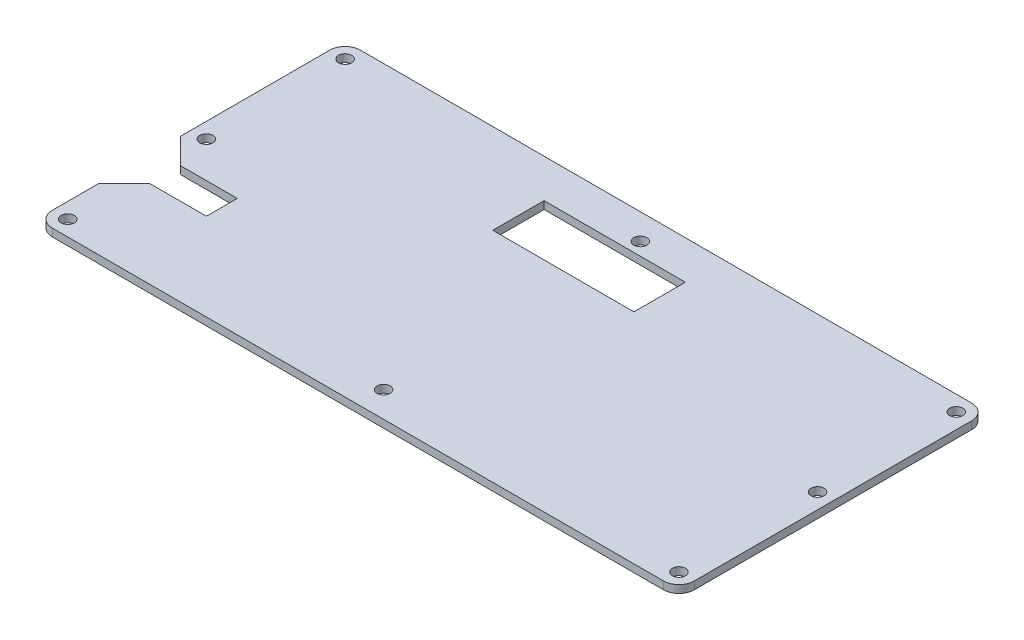
ISO-10303-21;
HEADER;
FILE_DESCRIPTION(('STEP AP214'),'2;1');
FILE_NAME('part.step','',(''),(''),'','','');
FILE_SCHEMA(('AUTOMOTIVE_DESIGN { 1 0 10303 214 1 1 1 1 }'));
ENDSEC;
DATA;
#1=APPLICATION_CONTEXT('core data for automotive mechanical design processes');
#2=APPLICATION_PROTOCOL_DEFINITION('international standard','automotive_design',2000,#1);
#3=PRODUCT_CONTEXT('',#1,'mechanical');
#4=PRODUCT('Part','Part','',(#3));
#5=PRODUCT_RELATED_PRODUCT_CATEGORY('part','',(#4));
#6=PRODUCT_DEFINITION_FORMATION('','',#4);
#7=PRODUCT_DEFINITION_CONTEXT('part definition',#1,'design');
#8=PRODUCT_DEFINITION('design','',#6,#7);
#9=PRODUCT_DEFINITION_SHAPE('','',#8);
#10=(LENGTH_UNIT() NAMED_UNIT(*) SI_UNIT(.MILLI.,.METRE.));
#11=(NAMED_UNIT(*) PLANE_ANGLE_UNIT() SI_UNIT($,.RADIAN.));
#12=(NAMED_UNIT(*) SI_UNIT($,.STERADIAN.) SOLID_ANGLE_UNIT());
#13=UNCERTAINTY_MEASURE_WITH_UNIT(LENGTH_MEASURE(1.E-05),#10,'distance_accuracy_value','');
#14=(GEOMETRIC_REPRESENTATION_CONTEXT(3) GLOBAL_UNCERTAINTY_ASSIGNED_CONTEXT((#13)) GLOBAL_UNIT_ASSIGNED_CONTEXT((#10,
#11,#12)) REPRESENTATION_CONTEXT('',''));
#15=CARTESIAN_POINT('',(0.,0.,0.));
#16=DIRECTION('',(0.,0.,1.));
#17=DIRECTION('',(1.,0.,0.));
#18=AXIS2_PLACEMENT_3D('',#15,#16,#17);
#19=CARTESIAN_POINT('',(22.2077113104315,3.,-126.233643966349));
#20=DIRECTION('',(0.,1.,0.));
#21=DIRECTION('',(0.,0.,1.));
#22=AXIS2_PLACEMENT_3D('',#19,#20,#21);
#23=PLANE('',#22);
#24=CARTESIAN_POINT('',(260.207711310431,3.,-72.2336439663486));
#25=DIRECTION('',(0.,1.,0.));
#26=DIRECTION('',(0.,0.,1.));
#27=AXIS2_PLACEMENT_3D('',#24,#25,#26);
#28=CIRCLE('',#27,2.55);
#29=CARTESIAN_POINT('',(260.207711310431,3.,-69.6836439663486));
#30=VERTEX_POINT('',#29);
#31=EDGE_CURVE('E201',#30,#30,#28,.T.);
#32=ORIENTED_EDGE('',*,*,#31,.F.);
#33=EDGE_LOOP('',(#32));
#34=FACE_BOUND('',#33,.T.);
#35=CARTESIAN_POINT('',(260.207711310431,3.,-18.2336439663486));
#36=DIRECTION('',(0.,1.,0.));
#37=DIRECTION('',(0.,0.,1.));
#38=AXIS2_PLACEMENT_3D('',#35,#36,#37);
#39=CIRCLE('',#38,2.54999999999955);
#40=CARTESIAN_POINT('',(260.207711310431,3.,-15.6836439663491));
#41=VERTEX_POINT('',#40);
#42=EDGE_CURVE('E213',#41,#41,#39,.T.);
#43=ORIENTED_EDGE('',*,*,#42,.F.);
#44=EDGE_LOOP('',(#43));
#45=FACE_BOUND('',#44,.T.);
#46=CARTESIAN_POINT('',(141.207711310431,3.,-122.233643966349));
#47=DIRECTION('',(0.,1.,0.));
#48=DIRECTION('',(0.,0.,1.));
#49=AXIS2_PLACEMENT_3D('',#46,#47,#48);
#50=CIRCLE('',#49,2.55);
#51=CARTESIAN_POINT('',(141.207711310431,3.,-119.683643966349));
#52=VERTEX_POINT('',#51);
#53=EDGE_CURVE('E225',#52,#52,#50,.T.);
#54=ORIENTED_EDGE('',*,*,#53,.F.);
#55=EDGE_LOOP('',(#54));
#56=FACE_BOUND('',#55,.T.);
#57=CARTESIAN_POINT('',(22.2077113104315,3.,-126.233643966349));
#58=DIRECTION('',(0.,1.,0.));
#59=DIRECTION('',(0.,0.,1.));
#60=AXIS2_PLACEMENT_3D('',#57,#58,#59);
#61=CIRCLE('',#60,2.55000000000045);
#62=CARTESIAN_POINT('',(22.2077113104315,3.,-123.683643966348));
#63=VERTEX_POINT('',#62);
#64=EDGE_CURVE('E237',#63,#63,#61,.T.);
#65=ORIENTED_EDGE('',*,*,#64,.F.);
#66=EDGE_LOOP('',(#65));
#67=FACE_BOUND('',#66,.T.);
#68=DIRECTION('',(0.70710678118654,0.,0.707106781186556));
#69=VECTOR('',#68,1.);
#70=CARTESIAN_POINT('',(26.2077113104315,3.,-58.2336439663486));
#71=LINE('',#70,#69);
#72=CARTESIAN_POINT('',(16.2077113104315,3.,-68.2336439663488));
#73=VERTEX_POINT('',#72);
#74=CARTESIAN_POINT('',(26.2077113104315,3.,-58.2336439663486));
#75=VERTEX_POINT('',#74);
#76=EDGE_CURVE('E243',#73,#75,#71,.T.);
#77=ORIENTED_EDGE('',*,*,#76,.T.);
#78=DIRECTION('',(1.,0.,0.));
#79=VECTOR('',#78,1.);
#80=CARTESIAN_POINT('',(26.2077113104315,3.,-58.2336439663486));
#81=LINE('',#80,#79);
#82=CARTESIAN_POINT('',(48.2077113104315,3.,-58.2336439663486));
#83=VERTEX_POINT('',#82);
#84=EDGE_CURVE('E246',#75,#83,#81,.T.);
#85=ORIENTED_EDGE('',*,*,#84,.T.);
#86=DIRECTION('',(0.,0.,1.));
#87=VECTOR('',#86,1.);
#88=CARTESIAN_POINT('',(48.2077113104315,3.,-58.2336439663486));
#89=LINE('',#88,#87);
#90=CARTESIAN_POINT('',(48.2077113104315,3.,-46.2336439663486));
#91=VERTEX_POINT('',#90);
#92=EDGE_CURVE('E249',#83,#91,#89,.T.);
#93=ORIENTED_EDGE('',*,*,#92,.T.);
#94=DIRECTION('',(-1.,0.,0.));
#95=VECTOR('',#94,1.);
#96=CARTESIAN_POINT('',(48.2077113104315,3.,-46.2336439663486));
#97=LINE('',#96,#95);
#98=CARTESIAN_POINT('',(26.2077113104315,3.,-46.2336439663486));
#99=VERTEX_POINT('',#98);
#100=EDGE_CURVE('E251',#91,#99,#97,.T.);
#101=ORIENTED_EDGE('',*,*,#100,.T.);
#102=DIRECTION('',(-0.707106781186539,0.,0.707106781186556));
#103=VECTOR('',#102,1.);
#104=CARTESIAN_POINT('',(26.2077113104315,3.,-46.2336439663486));
#105=LINE('',#104,#103);
#106=CARTESIAN_POINT('',(16.2077113104315,3.,-36.2336439663484));
#107=VERTEX_POINT('',#106);
#108=EDGE_CURVE('E253',#99,#107,#105,.T.);
#109=ORIENTED_EDGE('',*,*,#108,.T.);
#110=DIRECTION('',(0.,0.,1.));
#111=VECTOR('',#110,1.);
#112=CARTESIAN_POINT('',(16.2077113104315,3.,-18.2336439663486));
#113=LINE('',#112,#111);
#114=CARTESIAN_POINT('',(16.2077113104315,3.,-18.2336439663486));
#115=VERTEX_POINT('',#114);
#116=EDGE_CURVE('E255',#107,#115,#113,.T.);
#117=ORIENTED_EDGE('',*,*,#116,.T.);
#118=CARTESIAN_POINT('',(22.2077113104315,3.,-18.2336439663486));
#119=DIRECTION('',(0.,1.,0.));
#120=DIRECTION('',(0.,0.,1.));
#121=AXIS2_PLACEMENT_3D('',#118,#119,#120);
#122=CIRCLE('',#121,6.);
#123=CARTESIAN_POINT('',(22.2077113104315,3.,-12.2336439663486));
#124=VERTEX_POINT('',#123);
#125=EDGE_CURVE('E257',#115,#124,#122,.T.);
#126=ORIENTED_EDGE('',*,*,#125,.T.);
#127=DIRECTION('',(1.,0.,0.));
#128=VECTOR('',#127,1.);
#129=CARTESIAN_POINT('',(260.207711310431,3.,-12.2336439663486));
#130=LINE('',#129,#128);
#131=CARTESIAN_POINT('',(260.207711310431,3.,-12.2336439663486));
#132=VERTEX_POINT('',#131);
#133=EDGE_CURVE('E259',#124,#132,#130,.T.);
#134=ORIENTED_EDGE('',*,*,#133,.T.);
#135=CARTESIAN_POINT('',(260.207711310431,3.,-18.2336439663486));
#136=DIRECTION('',(0.,1.,0.));
#137=DIRECTION('',(0.,0.,1.));
#138=AXIS2_PLACEMENT_3D('',#135,#136,#137);
#139=CIRCLE('',#138,6.);
#140=CARTESIAN_POINT('',(266.207711310431,3.,-18.2336439663486));
#141=VERTEX_POINT('',#140);
#142=EDGE_CURVE('E261',#132,#141,#139,.T.);
#143=ORIENTED_EDGE('',*,*,#142,.T.);
#144=DIRECTION('',(0.,0.,-1.));
#145=VECTOR('',#144,1.);
#146=CARTESIAN_POINT('',(266.207711310431,3.,-126.233643966349));
#147=LINE('',#146,#145);
#148=CARTESIAN_POINT('',(266.207711310431,3.,-126.233643966349));
#149=VERTEX_POINT('',#148);
#150=EDGE_CURVE('E263',#141,#149,#147,.T.);
#151=ORIENTED_EDGE('',*,*,#150,.T.);
#152=CARTESIAN_POINT('',(260.207711310431,3.,-126.233643966349));
#153=DIRECTION('',(0.,1.,0.));
#154=DIRECTION('',(0.,0.,1.));
#155=AXIS2_PLACEMENT_3D('',#152,#153,#154);
#156=CIRCLE('',#155,6.00000000000001);
#157=CARTESIAN_POINT('',(260.207711310431,3.,-132.233643966349));
#158=VERTEX_POINT('',#157);
#159=EDGE_CURVE('E265',#149,#158,#156,.T.);
#160=ORIENTED_EDGE('',*,*,#159,.T.);
#161=DIRECTION('',(-1.,0.,0.));
#162=VECTOR('',#161,1.);
#163=CARTESIAN_POINT('',(22.2077113104315,3.,-132.233643966349));
#164=LINE('',#163,#162);
#165=CARTESIAN_POINT('',(22.2077113104315,3.,-132.233643966349));
#166=VERTEX_POINT('',#165);
#167=EDGE_CURVE('E267',#158,#166,#164,.T.);
#168=ORIENTED_EDGE('',*,*,#167,.T.);
#169=CARTESIAN_POINT('',(22.2077113104315,3.,-126.233643966349));
#170=DIRECTION('',(0.,1.,0.));
#171=DIRECTION('',(0.,0.,1.));
#172=AXIS2_PLACEMENT_3D('',#169,#170,#171);
#173=CIRCLE('',#172,6.);
#174=CARTESIAN_POINT('',(16.2077113104315,3.,-126.233643966349));
#175=VERTEX_POINT('',#174);
#176=EDGE_CURVE('E269',#166,#175,#173,.T.);
#177=ORIENTED_EDGE('',*,*,#176,.T.);
#178=DIRECTION('',(0.,0.,1.));
#179=VECTOR('',#178,1.);
#180=CARTESIAN_POINT('',(16.2077113104315,3.,-68.2336439663488));
#181=LINE('',#180,#179);
#182=EDGE_CURVE('E271',#175,#73,#181,.T.);
#183=ORIENTED_EDGE('',*,*,#182,.T.);
#184=EDGE_LOOP('',(#77,#85,#93,#101,#109,#117,#126,#134,#143,#151,#160,#168,#177,#183));
#185=FACE_BOUND('',#184,.T.);
#186=CARTESIAN_POINT('',(260.207711310431,3.,-126.233643966349));
#187=DIRECTION('',(0.,1.,0.));
#188=DIRECTION('',(0.,0.,1.));
#189=AXIS2_PLACEMENT_3D('',#186,#187,#188);
#190=CIRCLE('',#189,2.54999999999955);
#191=CARTESIAN_POINT('',(260.207711310431,3.,-123.683643966349));
#192=VERTEX_POINT('',#191);
#193=EDGE_CURVE('E231',#192,#192,#190,.T.);
#194=ORIENTED_EDGE('',*,*,#193,.F.);
#195=EDGE_LOOP('',(#194));
#196=FACE_BOUND('',#195,.T.);
#197=CARTESIAN_POINT('',(22.2077113104315,3.,-18.2336439663486));
#198=DIRECTION('',(0.,1.,0.));
#199=DIRECTION('',(0.,0.,1.));
#200=AXIS2_PLACEMENT_3D('',#197,#198,#199);
#201=CIRCLE('',#200,2.55000000000045);
#202=CARTESIAN_POINT('',(22.2077113104315,3.,-15.6836439663482));
#203=VERTEX_POINT('',#202);
#204=EDGE_CURVE('E219',#203,#203,#201,.T.);
#205=ORIENTED_EDGE('',*,*,#204,.F.);
#206=EDGE_LOOP('',(#205));
#207=FACE_BOUND('',#206,.T.);
#208=CARTESIAN_POINT('',(141.207711310431,3.,-22.2336439663486));
#209=DIRECTION('',(0.,1.,0.));
#210=DIRECTION('',(0.,0.,1.));
#211=AXIS2_PLACEMENT_3D('',#208,#209,#210);
#212=CIRCLE('',#211,2.55);
#213=CARTESIAN_POINT('',(141.207711310431,3.,-19.6836439663486));
#214=VERTEX_POINT('',#213);
#215=EDGE_CURVE('E207',#214,#214,#212,.T.);
#216=ORIENTED_EDGE('',*,*,#215,.F.);
#217=EDGE_LOOP('',(#216));
#218=FACE_BOUND('',#217,.T.);
#219=CARTESIAN_POINT('',(22.2077113104319,3.,-72.2336439663486));
#220=DIRECTION('',(0.,1.,0.));
#221=DIRECTION('',(0.,0.,1.));
#222=AXIS2_PLACEMENT_3D('',#219,#220,#221);
#223=CIRCLE('',#222,2.55);
#224=CARTESIAN_POINT('',(22.2077113104319,3.,-69.6836439663486));
#225=VERTEX_POINT('',#224);
#226=EDGE_CURVE('E195',#225,#225,#223,.T.);
#227=ORIENTED_EDGE('',*,*,#226,.F.);
#228=EDGE_LOOP('',(#227));
#229=FACE_BOUND('',#228,.T.);
#230=DIRECTION('',(0.,0.,-1.));
#231=VECTOR('',#230,1.);
#232=CARTESIAN_POINT('',(163.707711310431,3.,-117.233643966349));
#233=LINE('',#232,#231);
#234=CARTESIAN_POINT('',(163.707711310431,3.,-97.2336439663486));
#235=VERTEX_POINT('',#234);
#236=CARTESIAN_POINT('',(163.707711310431,3.,-117.233643966349));
#237=VERTEX_POINT('',#236);
#238=EDGE_CURVE('E167',#235,#237,#233,.T.);
#239=ORIENTED_EDGE('',*,*,#238,.F.);
#240=DIRECTION('',(1.,0.,0.));
#241=VECTOR('',#240,1.);
#242=CARTESIAN_POINT('',(163.707711310431,3.,-97.2336439663486));
#243=LINE('',#242,#241);
#244=CARTESIAN_POINT('',(108.707711310431,3.,-97.2336439663486));
#245=VERTEX_POINT('',#244);
#246=EDGE_CURVE('E159',#245,#235,#243,.T.);
#247=ORIENTED_EDGE('',*,*,#246,.F.);
#248=DIRECTION('',(0.,0.,1.));
#249=VECTOR('',#248,1.);
#250=CARTESIAN_POINT('',(108.707711310431,3.,-97.2336439663486));
#251=LINE('',#250,#249);
#252=CARTESIAN_POINT('',(108.707711310431,3.,-117.233643966349));
#253=VERTEX_POINT('',#252);
#254=EDGE_CURVE('E181',#253,#245,#251,.T.);
#255=ORIENTED_EDGE('',*,*,#254,.F.);
#256=DIRECTION('',(-1.,0.,0.));
#257=VECTOR('',#256,1.);
#258=CARTESIAN_POINT('',(108.707711310431,3.,-117.233643966349));
#259=LINE('',#258,#257);
#260=EDGE_CURVE('E179',#237,#253,#259,.T.);
#261=ORIENTED_EDGE('',*,*,#260,.F.);
#262=EDGE_LOOP('',(#239,#247,#255,#261));
#263=FACE_BOUND('',#262,.T.);
#264=ADVANCED_FACE('F34',(#34,#45,#56,#67,#185,#196,#207,#218,#229,#263),#23,.T.);
#265=CARTESIAN_POINT('',(22.2077113104315,0.,-126.233643966349));
#266=DIRECTION('',(0.,1.,0.));
#267=DIRECTION('',(0.,0.,1.));
#268=AXIS2_PLACEMENT_3D('',#265,#266,#267);
#269=PLANE('',#268);
#270=CARTESIAN_POINT('',(22.2077113104319,0.,-72.2336439663486));
#271=DIRECTION('',(0.,1.,0.));
#272=DIRECTION('',(0.,0.,1.));
#273=AXIS2_PLACEMENT_3D('',#270,#271,#272);
#274=CIRCLE('',#273,2.55);
#275=CARTESIAN_POINT('',(22.2077113104319,0.,-69.6836439663486));
#276=VERTEX_POINT('',#275);
#277=EDGE_CURVE('E175',#276,#276,#274,.T.);
#278=ORIENTED_EDGE('',*,*,#277,.T.);
#279=EDGE_LOOP('',(#278));
#280=FACE_BOUND('',#279,.T.);
#281=CARTESIAN_POINT('',(260.207711310431,0.,-72.2336439663486));
#282=DIRECTION('',(0.,1.,0.));
#283=DIRECTION('',(0.,0.,1.));
#284=AXIS2_PLACEMENT_3D('',#281,#282,#283);
#285=CIRCLE('',#284,2.55);
#286=CARTESIAN_POINT('',(260.207711310431,0.,-69.6836439663486));
#287=VERTEX_POINT('',#286);
#288=EDGE_CURVE('E198',#287,#287,#285,.T.);
#289=ORIENTED_EDGE('',*,*,#288,.T.);
#290=EDGE_LOOP('',(#289));
#291=FACE_BOUND('',#290,.T.);
#292=CARTESIAN_POINT('',(141.207711310431,0.,-22.2336439663486));
#293=DIRECTION('',(0.,1.,0.));
#294=DIRECTION('',(0.,0.,1.));
#295=AXIS2_PLACEMENT_3D('',#292,#293,#294);
#296=CIRCLE('',#295,2.55);
#297=CARTESIAN_POINT('',(141.207711310431,0.,-19.6836439663486));
#298=VERTEX_POINT('',#297);
#299=EDGE_CURVE('E204',#298,#298,#296,.T.);
#300=ORIENTED_EDGE('',*,*,#299,.T.);
#301=EDGE_LOOP('',(#300));
#302=FACE_BOUND('',#301,.T.);
#303=CARTESIAN_POINT('',(260.207711310431,0.,-18.2336439663486));
#304=DIRECTION('',(0.,1.,0.));
#305=DIRECTION('',(0.,0.,1.));
#306=AXIS2_PLACEMENT_3D('',#303,#304,#305);
#307=CIRCLE('',#306,2.54999999999955);
#308=CARTESIAN_POINT('',(260.207711310431,0.,-15.6836439663491));
#309=VERTEX_POINT('',#308);
#310=EDGE_CURVE('E210',#309,#309,#307,.T.);
#311=ORIENTED_EDGE('',*,*,#310,.T.);
#312=EDGE_LOOP('',(#311));
#313=FACE_BOUND('',#312,.T.);
#314=CARTESIAN_POINT('',(22.2077113104315,0.,-18.2336439663486));
#315=DIRECTION('',(0.,1.,0.));
#316=DIRECTION('',(0.,0.,1.));
#317=AXIS2_PLACEMENT_3D('',#314,#315,#316);
#318=CIRCLE('',#317,2.55000000000045);
#319=CARTESIAN_POINT('',(22.2077113104315,0.,-15.6836439663482));
#320=VERTEX_POINT('',#319);
#321=EDGE_CURVE('E216',#320,#320,#318,.T.);
#322=ORIENTED_EDGE('',*,*,#321,.T.);
#323=EDGE_LOOP('',(#322));
#324=FACE_BOUND('',#323,.T.);
#325=CARTESIAN_POINT('',(141.207711310431,0.,-122.233643966349));
#326=DIRECTION('',(0.,1.,0.));
#327=DIRECTION('',(0.,0.,1.));
#328=AXIS2_PLACEMENT_3D('',#325,#326,#327);
#329=CIRCLE('',#328,2.55);
#330=CARTESIAN_POINT('',(141.207711310431,0.,-119.683643966349));
#331=VERTEX_POINT('',#330);
#332=EDGE_CURVE('E222',#331,#331,#329,.T.);
#333=ORIENTED_EDGE('',*,*,#332,.T.);
#334=EDGE_LOOP('',(#333));
#335=FACE_BOUND('',#334,.T.);
#336=CARTESIAN_POINT('',(260.207711310431,0.,-126.233643966349));
#337=DIRECTION('',(0.,1.,0.));
#338=DIRECTION('',(0.,0.,1.));
#339=AXIS2_PLACEMENT_3D('',#336,#337,#338);
#340=CIRCLE('',#339,2.54999999999955);
#341=CARTESIAN_POINT('',(260.207711310431,0.,-123.683643966349));
#342=VERTEX_POINT('',#341);
#343=EDGE_CURVE('E228',#342,#342,#340,.T.);
#344=ORIENTED_EDGE('',*,*,#343,.T.);
#345=EDGE_LOOP('',(#344));
#346=FACE_BOUND('',#345,.T.);
#347=CARTESIAN_POINT('',(22.2077113104315,0.,-126.233643966349));
#348=DIRECTION('',(0.,1.,0.));
#349=DIRECTION('',(0.,0.,1.));
#350=AXIS2_PLACEMENT_3D('',#347,#348,#349);
#351=CIRCLE('',#350,2.55000000000045);
#352=CARTESIAN_POINT('',(22.2077113104315,0.,-123.683643966348));
#353=VERTEX_POINT('',#352);
#354=EDGE_CURVE('E234',#353,#353,#351,.T.);
#355=ORIENTED_EDGE('',*,*,#354,.T.);
#356=EDGE_LOOP('',(#355));
#357=FACE_BOUND('',#356,.T.);
#358=DIRECTION('',(0.70710678118654,0.,0.707106781186556));
#359=VECTOR('',#358,1.);
#360=CARTESIAN_POINT('',(26.2077113104315,0.,-58.2336439663486));
#361=LINE('',#360,#359);
#362=CARTESIAN_POINT('',(16.2077113104315,0.,-68.2336439663488));
#363=VERTEX_POINT('',#362);
#364=CARTESIAN_POINT('',(26.2077113104315,0.,-58.2336439663486));
#365=VERTEX_POINT('',#364);
#366=EDGE_CURVE('E240',#363,#365,#361,.T.);
#367=ORIENTED_EDGE('',*,*,#366,.F.);
#368=DIRECTION('',(0.,0.,1.));
#369=VECTOR('',#368,1.);
#370=CARTESIAN_POINT('',(16.2077113104315,0.,-68.2336439663488));
#371=LINE('',#370,#369);
#372=CARTESIAN_POINT('',(16.2077113104315,0.,-126.233643966349));
#373=VERTEX_POINT('',#372);
#374=EDGE_CURVE('E247',#373,#363,#371,.T.);
#375=ORIENTED_EDGE('',*,*,#374,.F.);
#376=CARTESIAN_POINT('',(22.2077113104315,0.,-126.233643966349));
#377=DIRECTION('',(0.,1.,0.));
#378=DIRECTION('',(0.,0.,1.));
#379=AXIS2_PLACEMENT_3D('',#376,#377,#378);
#380=CIRCLE('',#379,6.);
#381=CARTESIAN_POINT('',(22.2077113104315,0.,-132.233643966349));
#382=VERTEX_POINT('',#381);
#383=EDGE_CURVE('E298',#382,#373,#380,.T.);
#384=ORIENTED_EDGE('',*,*,#383,.F.);
#385=DIRECTION('',(-1.,0.,0.));
#386=VECTOR('',#385,1.);
#387=CARTESIAN_POINT('',(22.2077113104315,0.,-132.233643966349));
#388=LINE('',#387,#386);
#389=CARTESIAN_POINT('',(260.207711310431,0.,-132.233643966349));
#390=VERTEX_POINT('',#389);
#391=EDGE_CURVE('E296',#390,#382,#388,.T.);
#392=ORIENTED_EDGE('',*,*,#391,.F.);
#393=CARTESIAN_POINT('',(260.207711310431,0.,-126.233643966349));
#394=DIRECTION('',(0.,1.,0.));
#395=DIRECTION('',(0.,0.,1.));
#396=AXIS2_PLACEMENT_3D('',#393,#394,#395);
#397=CIRCLE('',#396,6.00000000000001);
#398=CARTESIAN_POINT('',(266.207711310431,0.,-126.233643966349));
#399=VERTEX_POINT('',#398);
#400=EDGE_CURVE('E294',#399,#390,#397,.T.);
#401=ORIENTED_EDGE('',*,*,#400,.F.);
#402=DIRECTION('',(0.,0.,-1.));
#403=VECTOR('',#402,1.);
#404=CARTESIAN_POINT('',(266.207711310431,0.,-126.233643966349));
#405=LINE('',#404,#403);
#406=CARTESIAN_POINT('',(266.207711310431,0.,-18.2336439663486));
#407=VERTEX_POINT('',#406);
#408=EDGE_CURVE('E292',#407,#399,#405,.T.);
#409=ORIENTED_EDGE('',*,*,#408,.F.);
#410=CARTESIAN_POINT('',(260.207711310431,0.,-18.2336439663486));
#411=DIRECTION('',(0.,1.,0.));
#412=DIRECTION('',(0.,0.,1.));
#413=AXIS2_PLACEMENT_3D('',#410,#411,#412);
#414=CIRCLE('',#413,6.);
#415=CARTESIAN_POINT('',(260.207711310431,0.,-12.2336439663486));
#416=VERTEX_POINT('',#415);
#417=EDGE_CURVE('E290',#416,#407,#414,.T.);
#418=ORIENTED_EDGE('',*,*,#417,.F.);
#419=DIRECTION('',(1.,0.,0.));
#420=VECTOR('',#419,1.);
#421=CARTESIAN_POINT('',(260.207711310431,0.,-12.2336439663486));
#422=LINE('',#421,#420);
#423=CARTESIAN_POINT('',(22.2077113104315,0.,-12.2336439663486));
#424=VERTEX_POINT('',#423);
#425=EDGE_CURVE('E288',#424,#416,#422,.T.);
#426=ORIENTED_EDGE('',*,*,#425,.F.);
#427=CARTESIAN_POINT('',(22.2077113104315,0.,-18.2336439663486));
#428=DIRECTION('',(0.,1.,0.));
#429=DIRECTION('',(0.,0.,1.));
#430=AXIS2_PLACEMENT_3D('',#427,#428,#429);
#431=CIRCLE('',#430,6.);
#432=CARTESIAN_POINT('',(16.2077113104315,0.,-18.2336439663486));
#433=VERTEX_POINT('',#432);
#434=EDGE_CURVE('E286',#433,#424,#431,.T.);
#435=ORIENTED_EDGE('',*,*,#434,.F.);
#436=DIRECTION('',(0.,0.,1.));
#437=VECTOR('',#436,1.);
#438=CARTESIAN_POINT('',(16.2077113104315,0.,-18.2336439663486));
#439=LINE('',#438,#437);
#440=CARTESIAN_POINT('',(16.2077113104315,0.,-36.2336439663484));
#441=VERTEX_POINT('',#440);
#442=EDGE_CURVE('E284',#441,#433,#439,.T.);
#443=ORIENTED_EDGE('',*,*,#442,.F.);
#444=DIRECTION('',(-0.707106781186539,0.,0.707106781186556));
#445=VECTOR('',#444,1.);
#446=CARTESIAN_POINT('',(26.2077113104315,0.,-46.2336439663486));
#447=LINE('',#446,#445);
#448=CARTESIAN_POINT('',(26.2077113104315,0.,-46.2336439663486));
#449=VERTEX_POINT('',#448);
#450=EDGE_CURVE('E282',#449,#441,#447,.T.);
#451=ORIENTED_EDGE('',*,*,#450,.F.);
#452=DIRECTION('',(-1.,0.,0.));
#453=VECTOR('',#452,1.);
#454=CARTESIAN_POINT('',(48.2077113104315,0.,-46.2336439663486));
#455=LINE('',#454,#453);
#456=CARTESIAN_POINT('',(48.2077113104315,0.,-46.2336439663486));
#457=VERTEX_POINT('',#456);
#458=EDGE_CURVE('E280',#457,#449,#455,.T.);
#459=ORIENTED_EDGE('',*,*,#458,.F.);
#460=DIRECTION('',(0.,0.,1.));
#461=VECTOR('',#460,1.);
#462=CARTESIAN_POINT('',(48.2077113104315,0.,-58.2336439663486));
#463=LINE('',#462,#461);
#464=CARTESIAN_POINT('',(48.2077113104315,0.,-58.2336439663486));
#465=VERTEX_POINT('',#464);
#466=EDGE_CURVE('E278',#465,#457,#463,.T.);
#467=ORIENTED_EDGE('',*,*,#466,.F.);
#468=DIRECTION('',(1.,0.,0.));
#469=VECTOR('',#468,1.);
#470=CARTESIAN_POINT('',(26.2077113104315,0.,-58.2336439663486));
#471=LINE('',#470,#469);
#472=EDGE_CURVE('E276',#365,#465,#471,.T.);
#473=ORIENTED_EDGE('',*,*,#472,.F.);
#474=EDGE_LOOP('',(#367,#375,#384,#392,#401,#409,#418,#426,#435,#443,#451,#459,#467,#473));
#475=FACE_BOUND('',#474,.T.);
#476=DIRECTION('',(1.,0.,0.));
#477=VECTOR('',#476,1.);
#478=CARTESIAN_POINT('',(163.707711310431,0.,-97.2336439663486));
#479=LINE('',#478,#477);
#480=CARTESIAN_POINT('',(108.707711310431,0.,-97.2336439663486));
#481=VERTEX_POINT('',#480);
#482=CARTESIAN_POINT('',(163.707711310431,0.,-97.2336439663486));
#483=VERTEX_POINT('',#482);
#484=EDGE_CURVE('E57',#481,#483,#479,.T.);
#485=ORIENTED_EDGE('',*,*,#484,.T.);
#486=DIRECTION('',(0.,0.,-1.));
#487=VECTOR('',#486,1.);
#488=CARTESIAN_POINT('',(163.707711310431,0.,-117.233643966349));
#489=LINE('',#488,#487);
#490=CARTESIAN_POINT('',(163.707711310431,0.,-117.233643966349));
#491=VERTEX_POINT('',#490);
#492=EDGE_CURVE('E174',#483,#491,#489,.T.);
#493=ORIENTED_EDGE('',*,*,#492,.T.);
#494=DIRECTION('',(-1.,0.,0.));
#495=VECTOR('',#494,1.);
#496=CARTESIAN_POINT('',(108.707711310431,0.,-117.233643966349));
#497=LINE('',#496,#495);
#498=CARTESIAN_POINT('',(108.707711310431,0.,-117.233643966349));
#499=VERTEX_POINT('',#498);
#500=EDGE_CURVE('E187',#491,#499,#497,.T.);
#501=ORIENTED_EDGE('',*,*,#500,.T.);
#502=DIRECTION('',(0.,0.,1.));
#503=VECTOR('',#502,1.);
#504=CARTESIAN_POINT('',(108.707711310431,0.,-97.2336439663486));
#505=LINE('',#504,#503);
#506=EDGE_CURVE('E168',#499,#481,#505,.T.);
#507=ORIENTED_EDGE('',*,*,#506,.T.);
#508=EDGE_LOOP('',(#485,#493,#501,#507));
#509=FACE_BOUND('',#508,.T.);
#510=ADVANCED_FACE('F346',(#280,#291,#302,#313,#324,#335,#346,#357,#475,#509),#269,.F.);
#511=CARTESIAN_POINT('',(26.2077113104315,3.,-58.2336439663486));
#512=DIRECTION('',(0.707106781186555,0.,-0.707106781186539));
#513=DIRECTION('',(-0.707106781186539,0.,-0.707106781186556));
#514=AXIS2_PLACEMENT_3D('',#511,#512,#513);
#515=PLANE('',#514);
#516=ORIENTED_EDGE('',*,*,#366,.T.);
#517=DIRECTION('',(0.,-1.,0.));
#518=VECTOR('',#517,1.);
#519=CARTESIAN_POINT('',(26.2077113104315,3.,-58.2336439663486));
#520=LINE('',#519,#518);
#521=EDGE_CURVE('E11',#75,#365,#520,.T.);
#522=ORIENTED_EDGE('',*,*,#521,.F.);
#523=ORIENTED_EDGE('',*,*,#76,.F.);
#524=DIRECTION('',(0.,-1.,0.));
#525=VECTOR('',#524,1.);
#526=CARTESIAN_POINT('',(16.2077113104315,3.,-68.2336439663488));
#527=LINE('',#526,#525);
#528=EDGE_CURVE('E273',#73,#363,#527,.T.);
#529=ORIENTED_EDGE('',*,*,#528,.T.);
#530=EDGE_LOOP('',(#516,#522,#523,#529));
#531=FACE_BOUND('',#530,.T.);
#532=ADVANCED_FACE('F36',(#531),#515,.F.);
#533=CARTESIAN_POINT('',(26.2077113104315,3.,-58.2336439663486));
#534=DIRECTION('',(0.,0.,-1.));
#535=DIRECTION('',(-1.,0.,0.));
#536=AXIS2_PLACEMENT_3D('',#533,#534,#535);
#537=PLANE('',#536);
#538=ORIENTED_EDGE('',*,*,#472,.T.);
#539=DIRECTION('',(0.,-1.,0.));
#540=VECTOR('',#539,1.);
#541=CARTESIAN_POINT('',(48.2077113104315,3.,-58.2336439663486));
#542=LINE('',#541,#540);
#543=EDGE_CURVE('E42',#83,#465,#542,.T.);
#544=ORIENTED_EDGE('',*,*,#543,.F.);
#545=ORIENTED_EDGE('',*,*,#84,.F.);
#546=ORIENTED_EDGE('',*,*,#521,.T.);
#547=EDGE_LOOP('',(#538,#544,#545,#546));
#548=FACE_BOUND('',#547,.T.);
#549=ADVANCED_FACE('F364',(#548),#537,.F.);
#550=CARTESIAN_POINT('',(48.2077113104315,3.,-58.2336439663486));
#551=DIRECTION('',(1.,0.,0.));
#552=DIRECTION('',(0.,0.,-1.));
#553=AXIS2_PLACEMENT_3D('',#550,#551,#552);
#554=PLANE('',#553);
#555=ORIENTED_EDGE('',*,*,#466,.T.);
#556=DIRECTION('',(0.,-1.,0.));
#557=VECTOR('',#556,1.);
#558=CARTESIAN_POINT('',(48.2077113104315,3.,-46.2336439663486));
#559=LINE('',#558,#557);
#560=EDGE_CURVE('E333',#91,#457,#559,.T.);
#561=ORIENTED_EDGE('',*,*,#560,.F.);
#562=ORIENTED_EDGE('',*,*,#92,.F.);
#563=ORIENTED_EDGE('',*,*,#543,.T.);
#564=EDGE_LOOP('',(#555,#561,#562,#563));
#565=FACE_BOUND('',#564,.T.);
#566=ADVANCED_FACE('F340',(#565),#554,.F.);
#567=CARTESIAN_POINT('',(48.2077113104315,3.,-46.2336439663486));
#568=DIRECTION('',(0.,0.,1.));
#569=DIRECTION('',(1.,0.,0.));
#570=AXIS2_PLACEMENT_3D('',#567,#568,#569);
#571=PLANE('',#570);
#572=ORIENTED_EDGE('',*,*,#458,.T.);
#573=DIRECTION('',(0.,-1.,0.));
#574=VECTOR('',#573,1.);
#575=CARTESIAN_POINT('',(26.2077113104315,3.,-46.2336439663486));
#576=LINE('',#575,#574);
#577=EDGE_CURVE('E330',#99,#449,#576,.T.);
#578=ORIENTED_EDGE('',*,*,#577,.F.);
#579=ORIENTED_EDGE('',*,*,#100,.F.);
#580=ORIENTED_EDGE('',*,*,#560,.T.);
#581=EDGE_LOOP('',(#572,#578,#579,#580));
#582=FACE_BOUND('',#581,.T.);
#583=ADVANCED_FACE('F352',(#582),#571,.F.);
#584=CARTESIAN_POINT('',(26.2077113104315,3.,-46.2336439663486));
#585=DIRECTION('',(0.707106781186556,0.,0.707106781186539));
#586=DIRECTION('',(0.707106781186539,0.,-0.707106781186556));
#587=AXIS2_PLACEMENT_3D('',#584,#585,#586);
#588=PLANE('',#587);
#589=ORIENTED_EDGE('',*,*,#450,.T.);
#590=DIRECTION('',(0.,-1.,0.));
#591=VECTOR('',#590,1.);
#592=CARTESIAN_POINT('',(16.2077113104315,3.,-36.2336439663484));
#593=LINE('',#592,#591);
#594=EDGE_CURVE('E327',#107,#441,#593,.T.);
#595=ORIENTED_EDGE('',*,*,#594,.F.);
#596=ORIENTED_EDGE('',*,*,#108,.F.);
#597=ORIENTED_EDGE('',*,*,#577,.T.);
#598=EDGE_LOOP('',(#589,#595,#596,#597));
#599=FACE_BOUND('',#598,.T.);
#600=ADVANCED_FACE('F356',(#599),#588,.F.);
#601=CARTESIAN_POINT('',(16.2077113104315,3.,-18.2336439663486));
#602=DIRECTION('',(1.,0.,0.));
#603=DIRECTION('',(0.,0.,-1.));
#604=AXIS2_PLACEMENT_3D('',#601,#602,#603);
#605=PLANE('',#604);
#606=ORIENTED_EDGE('',*,*,#442,.T.);
#607=DIRECTION('',(0.,-1.,0.));
#608=VECTOR('',#607,1.);
#609=CARTESIAN_POINT('',(16.2077113104315,3.,-18.2336439663486));
#610=LINE('',#609,#608);
#611=EDGE_CURVE('E324',#115,#433,#610,.T.);
#612=ORIENTED_EDGE('',*,*,#611,.F.);
#613=ORIENTED_EDGE('',*,*,#116,.F.);
#614=ORIENTED_EDGE('',*,*,#594,.T.);
#615=EDGE_LOOP('',(#606,#612,#613,#614));
#616=FACE_BOUND('',#615,.T.);
#617=ADVANCED_FACE('F407',(#616),#605,.F.);
#618=CARTESIAN_POINT('',(22.2077113104315,3.,-18.2336439663486));
#619=DIRECTION('',(0.,-1.,0.));
#620=DIRECTION('',(0.,0.,-1.));
#621=AXIS2_PLACEMENT_3D('',#618,#619,#620);
#622=CYLINDRICAL_SURFACE('',#621,6.);
#623=ORIENTED_EDGE('',*,*,#434,.T.);
#624=DIRECTION('',(0.,-1.,0.));
#625=VECTOR('',#624,1.);
#626=CARTESIAN_POINT('',(22.2077113104315,3.,-12.2336439663486));
#627=LINE('',#626,#625);
#628=EDGE_CURVE('E321',#124,#424,#627,.T.);
#629=ORIENTED_EDGE('',*,*,#628,.F.);
#630=ORIENTED_EDGE('',*,*,#125,.F.);
#631=ORIENTED_EDGE('',*,*,#611,.T.);
#632=EDGE_LOOP('',(#623,#629,#630,#631));
#633=FACE_BOUND('',#632,.T.);
#634=ADVANCED_FACE('F405',(#633),#622,.T.);
#635=CARTESIAN_POINT('',(260.207711310431,3.,-12.2336439663486));
#636=DIRECTION('',(0.,0.,-1.));
#637=DIRECTION('',(-1.,0.,0.));
#638=AXIS2_PLACEMENT_3D('',#635,#636,#637);
#639=PLANE('',#638);
#640=ORIENTED_EDGE('',*,*,#425,.T.);
#641=DIRECTION('',(0.,-1.,0.));
#642=VECTOR('',#641,1.);
#643=CARTESIAN_POINT('',(260.207711310431,3.,-12.2336439663486));
#644=LINE('',#643,#642);
#645=EDGE_CURVE('E318',#132,#416,#644,.T.);
#646=ORIENTED_EDGE('',*,*,#645,.F.);
#647=ORIENTED_EDGE('',*,*,#133,.F.);
#648=ORIENTED_EDGE('',*,*,#628,.T.);
#649=EDGE_LOOP('',(#640,#646,#647,#648));
#650=FACE_BOUND('',#649,.T.);
#651=ADVANCED_FACE('F400',(#650),#639,.F.);
#652=CARTESIAN_POINT('',(260.207711310431,3.,-18.2336439663486));
#653=DIRECTION('',(0.,-1.,0.));
#654=DIRECTION('',(0.,0.,-1.));
#655=AXIS2_PLACEMENT_3D('',#652,#653,#654);
#656=CYLINDRICAL_SURFACE('',#655,6.);
#657=ORIENTED_EDGE('',*,*,#417,.T.);
#658=DIRECTION('',(0.,-1.,0.));
#659=VECTOR('',#658,1.);
#660=CARTESIAN_POINT('',(266.207711310431,3.,-18.2336439663486));
#661=LINE('',#660,#659);
#662=EDGE_CURVE('E315',#141,#407,#661,.T.);
#663=ORIENTED_EDGE('',*,*,#662,.F.);
#664=ORIENTED_EDGE('',*,*,#142,.F.);
#665=ORIENTED_EDGE('',*,*,#645,.T.);
#666=EDGE_LOOP('',(#657,#663,#664,#665));
#667=FACE_BOUND('',#666,.T.);
#668=ADVANCED_FACE('F395',(#667),#656,.T.);
#669=CARTESIAN_POINT('',(266.207711310431,3.,-126.233643966349));
#670=DIRECTION('',(-1.,0.,0.));
#671=DIRECTION('',(0.,0.,1.));
#672=AXIS2_PLACEMENT_3D('',#669,#670,#671);
#673=PLANE('',#672);
#674=ORIENTED_EDGE('',*,*,#408,.T.);
#675=DIRECTION('',(0.,-1.,0.));
#676=VECTOR('',#675,1.);
#677=CARTESIAN_POINT('',(266.207711310431,3.,-126.233643966349));
#678=LINE('',#677,#676);
#679=EDGE_CURVE('E312',#149,#399,#678,.T.);
#680=ORIENTED_EDGE('',*,*,#679,.F.);
#681=ORIENTED_EDGE('',*,*,#150,.F.);
#682=ORIENTED_EDGE('',*,*,#662,.T.);
#683=EDGE_LOOP('',(#674,#680,#681,#682));
#684=FACE_BOUND('',#683,.T.);
#685=ADVANCED_FACE('F391',(#684),#673,.F.);
#686=CARTESIAN_POINT('',(260.207711310431,3.,-126.233643966349));
#687=DIRECTION('',(0.,-1.,0.));
#688=DIRECTION('',(0.,0.,-1.));
#689=AXIS2_PLACEMENT_3D('',#686,#687,#688);
#690=CYLINDRICAL_SURFACE('',#689,6.00000000000001);
#691=ORIENTED_EDGE('',*,*,#400,.T.);
#692=DIRECTION('',(0.,-1.,0.));
#693=VECTOR('',#692,1.);
#694=CARTESIAN_POINT('',(260.207711310431,3.,-132.233643966349));
#695=LINE('',#694,#693);
#696=EDGE_CURVE('E309',#158,#390,#695,.T.);
#697=ORIENTED_EDGE('',*,*,#696,.F.);
#698=ORIENTED_EDGE('',*,*,#159,.F.);
#699=ORIENTED_EDGE('',*,*,#679,.T.);
#700=EDGE_LOOP('',(#691,#697,#698,#699));
#701=FACE_BOUND('',#700,.T.);
#702=ADVANCED_FACE('F386',(#701),#690,.T.);
#703=CARTESIAN_POINT('',(22.2077113104315,3.,-132.233643966349));
#704=DIRECTION('',(0.,0.,1.));
#705=DIRECTION('',(1.,0.,0.));
#706=AXIS2_PLACEMENT_3D('',#703,#704,#705);
#707=PLANE('',#706);
#708=ORIENTED_EDGE('',*,*,#391,.T.);
#709=DIRECTION('',(0.,-1.,0.));
#710=VECTOR('',#709,1.);
#711=CARTESIAN_POINT('',(22.2077113104315,3.,-132.233643966349));
#712=LINE('',#711,#710);
#713=EDGE_CURVE('E306',#166,#382,#712,.T.);
#714=ORIENTED_EDGE('',*,*,#713,.F.);
#715=ORIENTED_EDGE('',*,*,#167,.F.);
#716=ORIENTED_EDGE('',*,*,#696,.T.);
#717=EDGE_LOOP('',(#708,#714,#715,#716));
#718=FACE_BOUND('',#717,.T.);
#719=ADVANCED_FACE('F380',(#718),#707,.F.);
#720=CARTESIAN_POINT('',(22.2077113104315,3.,-126.233643966349));
#721=DIRECTION('',(0.,-1.,0.));
#722=DIRECTION('',(0.,0.,-1.));
#723=AXIS2_PLACEMENT_3D('',#720,#721,#722);
#724=CYLINDRICAL_SURFACE('',#723,6.);
#725=ORIENTED_EDGE('',*,*,#383,.T.);
#726=DIRECTION('',(0.,-1.,0.));
#727=VECTOR('',#726,1.);
#728=CARTESIAN_POINT('',(16.2077113104315,3.,-126.233643966349));
#729=LINE('',#728,#727);
#730=EDGE_CURVE('E303',#175,#373,#729,.T.);
#731=ORIENTED_EDGE('',*,*,#730,.F.);
#732=ORIENTED_EDGE('',*,*,#176,.F.);
#733=ORIENTED_EDGE('',*,*,#713,.T.);
#734=EDGE_LOOP('',(#725,#731,#732,#733));
#735=FACE_BOUND('',#734,.T.);
#736=ADVANCED_FACE('F376',(#735),#724,.T.);
#737=CARTESIAN_POINT('',(16.2077113104315,3.,-68.2336439663488));
#738=DIRECTION('',(1.,0.,0.));
#739=DIRECTION('',(0.,0.,-1.));
#740=AXIS2_PLACEMENT_3D('',#737,#738,#739);
#741=PLANE('',#740);
#742=ORIENTED_EDGE('',*,*,#374,.T.);
#743=ORIENTED_EDGE('',*,*,#528,.F.);
#744=ORIENTED_EDGE('',*,*,#182,.F.);
#745=ORIENTED_EDGE('',*,*,#730,.T.);
#746=EDGE_LOOP('',(#742,#743,#744,#745));
#747=FACE_BOUND('',#746,.T.);
#748=ADVANCED_FACE('F371',(#747),#741,.F.);
#749=CARTESIAN_POINT('',(22.2077113104315,3.,-126.233643966349));
#750=DIRECTION('',(0.,-1.,0.));
#751=DIRECTION('',(0.,0.,-1.));
#752=AXIS2_PLACEMENT_3D('',#749,#750,#751);
#753=CYLINDRICAL_SURFACE('',#752,2.55000000000045);
#754=ORIENTED_EDGE('',*,*,#64,.T.);
#755=EDGE_LOOP('',(#754));
#756=FACE_BOUND('',#755,.T.);
#757=ORIENTED_EDGE('',*,*,#354,.F.);
#758=EDGE_LOOP('',(#757));
#759=FACE_BOUND('',#758,.T.);
#760=ADVANCED_FACE('F427',(#756,#759),#753,.F.);
#761=CARTESIAN_POINT('',(260.207711310431,3.,-126.233643966349));
#762=DIRECTION('',(0.,-1.,0.));
#763=DIRECTION('',(0.,0.,-1.));
#764=AXIS2_PLACEMENT_3D('',#761,#762,#763);
#765=CYLINDRICAL_SURFACE('',#764,2.54999999999955);
#766=ORIENTED_EDGE('',*,*,#193,.T.);
#767=EDGE_LOOP('',(#766));
#768=FACE_BOUND('',#767,.T.);
#769=ORIENTED_EDGE('',*,*,#343,.F.);
#770=EDGE_LOOP('',(#769));
#771=FACE_BOUND('',#770,.T.);
#772=ADVANCED_FACE('F477',(#768,#771),#765,.F.);
#773=CARTESIAN_POINT('',(141.207711310431,3.,-122.233643966349));
#774=DIRECTION('',(0.,-1.,0.));
#775=DIRECTION('',(0.,0.,-1.));
#776=AXIS2_PLACEMENT_3D('',#773,#774,#775);
#777=CYLINDRICAL_SURFACE('',#776,2.55);
#778=ORIENTED_EDGE('',*,*,#53,.T.);
#779=EDGE_LOOP('',(#778));
#780=FACE_BOUND('',#779,.T.);
#781=ORIENTED_EDGE('',*,*,#332,.F.);
#782=EDGE_LOOP('',(#781));
#783=FACE_BOUND('',#782,.T.);
#784=ADVANCED_FACE('F484',(#780,#783),#777,.F.);
#785=CARTESIAN_POINT('',(22.2077113104315,3.,-18.2336439663486));
#786=DIRECTION('',(0.,-1.,0.));
#787=DIRECTION('',(0.,0.,-1.));
#788=AXIS2_PLACEMENT_3D('',#785,#786,#787);
#789=CYLINDRICAL_SURFACE('',#788,2.55000000000045);
#790=ORIENTED_EDGE('',*,*,#204,.T.);
#791=EDGE_LOOP('',(#790));
#792=FACE_BOUND('',#791,.T.);
#793=ORIENTED_EDGE('',*,*,#321,.F.);
#794=EDGE_LOOP('',(#793));
#795=FACE_BOUND('',#794,.T.);
#796=ADVANCED_FACE('F491',(#792,#795),#789,.F.);
#797=CARTESIAN_POINT('',(260.207711310431,3.,-18.2336439663486));
#798=DIRECTION('',(0.,-1.,0.));
#799=DIRECTION('',(0.,0.,-1.));
#800=AXIS2_PLACEMENT_3D('',#797,#798,#799);
#801=CYLINDRICAL_SURFACE('',#800,2.54999999999955);
#802=ORIENTED_EDGE('',*,*,#42,.T.);
#803=EDGE_LOOP('',(#802));
#804=FACE_BOUND('',#803,.T.);
#805=ORIENTED_EDGE('',*,*,#310,.F.);
#806=EDGE_LOOP('',(#805));
#807=FACE_BOUND('',#806,.T.);
#808=ADVANCED_FACE('F499',(#804,#807),#801,.F.);
#809=CARTESIAN_POINT('',(141.207711310431,3.,-22.2336439663486));
#810=DIRECTION('',(0.,-1.,0.));
#811=DIRECTION('',(0.,0.,-1.));
#812=AXIS2_PLACEMENT_3D('',#809,#810,#811);
#813=CYLINDRICAL_SURFACE('',#812,2.55);
#814=ORIENTED_EDGE('',*,*,#215,.T.);
#815=EDGE_LOOP('',(#814));
#816=FACE_BOUND('',#815,.T.);
#817=ORIENTED_EDGE('',*,*,#299,.F.);
#818=EDGE_LOOP('',(#817));
#819=FACE_BOUND('',#818,.T.);
#820=ADVANCED_FACE('F507',(#816,#819),#813,.F.);
#821=CARTESIAN_POINT('',(260.207711310431,3.,-72.2336439663486));
#822=DIRECTION('',(0.,-1.,0.));
#823=DIRECTION('',(0.,0.,-1.));
#824=AXIS2_PLACEMENT_3D('',#821,#822,#823);
#825=CYLINDRICAL_SURFACE('',#824,2.55);
#826=ORIENTED_EDGE('',*,*,#31,.T.);
#827=EDGE_LOOP('',(#826));
#828=FACE_BOUND('',#827,.T.);
#829=ORIENTED_EDGE('',*,*,#288,.F.);
#830=EDGE_LOOP('',(#829));
#831=FACE_BOUND('',#830,.T.);
#832=ADVANCED_FACE('F515',(#828,#831),#825,.F.);
#833=CARTESIAN_POINT('',(22.2077113104319,3.,-72.2336439663486));
#834=DIRECTION('',(0.,-1.,0.));
#835=DIRECTION('',(0.,0.,-1.));
#836=AXIS2_PLACEMENT_3D('',#833,#834,#835);
#837=CYLINDRICAL_SURFACE('',#836,2.55);
#838=ORIENTED_EDGE('',*,*,#226,.T.);
#839=EDGE_LOOP('',(#838));
#840=FACE_BOUND('',#839,.T.);
#841=ORIENTED_EDGE('',*,*,#277,.F.);
#842=EDGE_LOOP('',(#841));
#843=FACE_BOUND('',#842,.T.);
#844=ADVANCED_FACE('F523',(#840,#843),#837,.F.);
#845=CARTESIAN_POINT('',(163.707711310431,3.,-97.2336439663486));
#846=DIRECTION('',(0.,0.,-1.));
#847=DIRECTION('',(-1.,0.,0.));
#848=AXIS2_PLACEMENT_3D('',#845,#846,#847);
#849=PLANE('',#848);
#850=ORIENTED_EDGE('',*,*,#484,.F.);
#851=DIRECTION('',(0.,-1.,0.));
#852=VECTOR('',#851,1.);
#853=CARTESIAN_POINT('',(108.707711310431,3.,-97.2336439663486));
#854=LINE('',#853,#852);
#855=EDGE_CURVE('E163',#245,#481,#854,.T.);
#856=ORIENTED_EDGE('',*,*,#855,.F.);
#857=ORIENTED_EDGE('',*,*,#246,.T.);
#858=DIRECTION('',(0.,-1.,0.));
#859=VECTOR('',#858,1.);
#860=CARTESIAN_POINT('',(163.707711310431,3.,-97.2336439663486));
#861=LINE('',#860,#859);
#862=EDGE_CURVE('E162',#235,#483,#861,.T.);
#863=ORIENTED_EDGE('',*,*,#862,.T.);
#864=EDGE_LOOP('',(#850,#856,#857,#863));
#865=FACE_BOUND('',#864,.T.);
#866=ADVANCED_FACE('F161',(#865),#849,.T.);
#867=CARTESIAN_POINT('',(163.707711310431,3.,-117.233643966349));
#868=DIRECTION('',(-1.,0.,0.));
#869=DIRECTION('',(0.,0.,1.));
#870=AXIS2_PLACEMENT_3D('',#867,#868,#869);
#871=PLANE('',#870);
#872=ORIENTED_EDGE('',*,*,#492,.F.);
#873=ORIENTED_EDGE('',*,*,#862,.F.);
#874=ORIENTED_EDGE('',*,*,#238,.T.);
#875=DIRECTION('',(0.,-1.,0.));
#876=VECTOR('',#875,1.);
#877=CARTESIAN_POINT('',(163.707711310431,3.,-117.233643966349));
#878=LINE('',#877,#876);
#879=EDGE_CURVE('E176',#237,#491,#878,.T.);
#880=ORIENTED_EDGE('',*,*,#879,.T.);
#881=EDGE_LOOP('',(#872,#873,#874,#880));
#882=FACE_BOUND('',#881,.T.);
#883=ADVANCED_FACE('F171',(#882),#871,.T.);
#884=CARTESIAN_POINT('',(108.707711310431,3.,-117.233643966349));
#885=DIRECTION('',(0.,0.,1.));
#886=DIRECTION('',(1.,0.,0.));
#887=AXIS2_PLACEMENT_3D('',#884,#885,#886);
#888=PLANE('',#887);
#889=ORIENTED_EDGE('',*,*,#500,.F.);
#890=ORIENTED_EDGE('',*,*,#879,.F.);
#891=ORIENTED_EDGE('',*,*,#260,.T.);
#892=DIRECTION('',(0.,-1.,0.));
#893=VECTOR('',#892,1.);
#894=CARTESIAN_POINT('',(108.707711310431,3.,-117.233643966349));
#895=LINE('',#894,#893);
#896=EDGE_CURVE('E49',#253,#499,#895,.T.);
#897=ORIENTED_EDGE('',*,*,#896,.T.);
#898=EDGE_LOOP('',(#889,#890,#891,#897));
#899=FACE_BOUND('',#898,.T.);
#900=ADVANCED_FACE('F544',(#899),#888,.T.);
#901=CARTESIAN_POINT('',(108.707711310431,3.,-97.2336439663486));
#902=DIRECTION('',(1.,0.,0.));
#903=DIRECTION('',(0.,0.,-1.));
#904=AXIS2_PLACEMENT_3D('',#901,#902,#903);
#905=PLANE('',#904);
#906=ORIENTED_EDGE('',*,*,#506,.F.);
#907=ORIENTED_EDGE('',*,*,#896,.F.);
#908=ORIENTED_EDGE('',*,*,#254,.T.);
#909=ORIENTED_EDGE('',*,*,#855,.T.);
#910=EDGE_LOOP('',(#906,#907,#908,#909));
#911=FACE_BOUND('',#910,.T.);
#912=ADVANCED_FACE('F551',(#911),#905,.T.);
#913=CLOSED_SHELL('',(#264,#510,#532,#549,#566,#583,#600,#617,#634,#651,#668,#685,#702,#719,
#736,#748,#760,#772,#784,#796,#808,#820,#832,#844,#866,#883,#900,#912));
#914=MANIFOLD_SOLID_BREP('B2',#913);
#915=ADVANCED_BREP_SHAPE_REPRESENTATION('',(#18,#914),#14);
#916=SHAPE_DEFINITION_REPRESENTATION(#9,#915);
ENDSEC;
END-ISO-10303-21;
